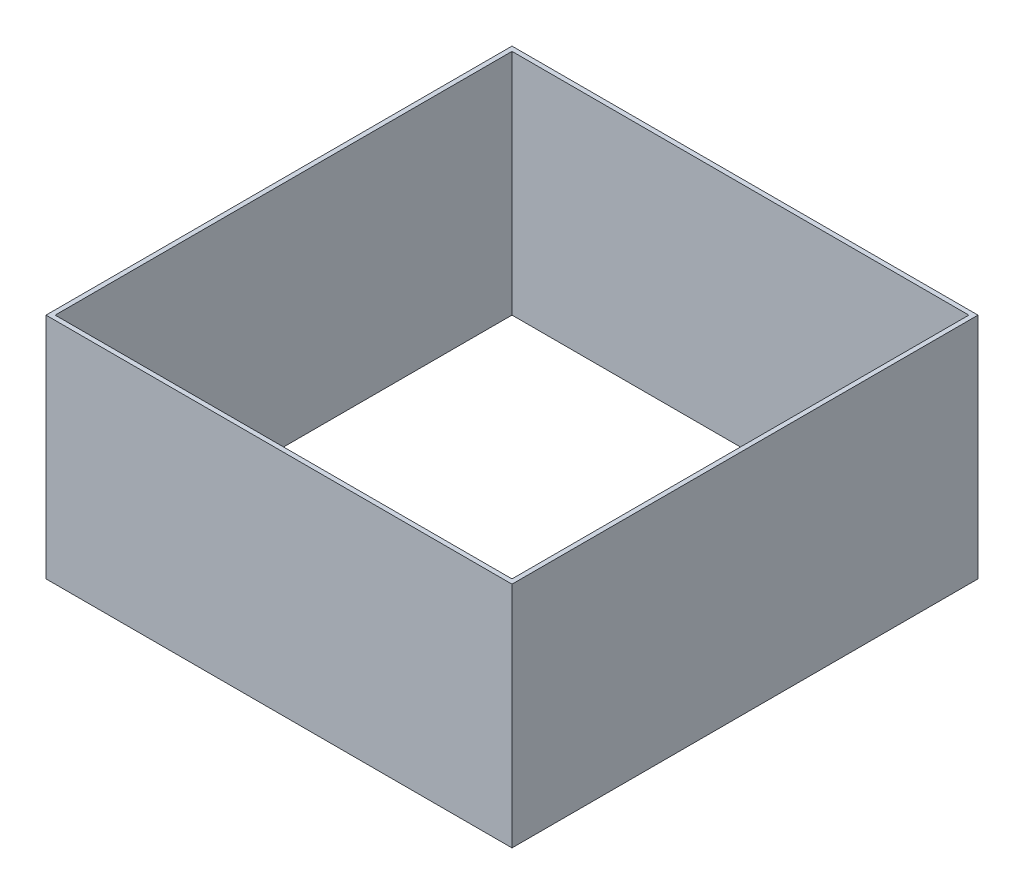
ISO-10303-21;
HEADER;
FILE_DESCRIPTION(('STEP AP214'),'2;1');
FILE_NAME('part.step','',(''),(''),'','','');
FILE_SCHEMA(('AUTOMOTIVE_DESIGN { 1 0 10303 214 1 1 1 1 }'));
ENDSEC;
DATA;
#1=APPLICATION_CONTEXT('core data for automotive mechanical design processes');
#2=APPLICATION_PROTOCOL_DEFINITION('international standard','automotive_design',2000,#1);
#3=PRODUCT_CONTEXT('',#1,'mechanical');
#4=PRODUCT('Part','Part','',(#3));
#5=PRODUCT_RELATED_PRODUCT_CATEGORY('part','',(#4));
#6=PRODUCT_DEFINITION_FORMATION('','',#4);
#7=PRODUCT_DEFINITION_CONTEXT('part definition',#1,'design');
#8=PRODUCT_DEFINITION('design','',#6,#7);
#9=PRODUCT_DEFINITION_SHAPE('','',#8);
#10=(LENGTH_UNIT() NAMED_UNIT(*) SI_UNIT(.MILLI.,.METRE.));
#11=(NAMED_UNIT(*) PLANE_ANGLE_UNIT() SI_UNIT($,.RADIAN.));
#12=(NAMED_UNIT(*) SI_UNIT($,.STERADIAN.) SOLID_ANGLE_UNIT());
#13=UNCERTAINTY_MEASURE_WITH_UNIT(LENGTH_MEASURE(1.E-05),#10,'distance_accuracy_value','');
#14=(GEOMETRIC_REPRESENTATION_CONTEXT(3) GLOBAL_UNCERTAINTY_ASSIGNED_CONTEXT((#13)) GLOBAL_UNIT_ASSIGNED_CONTEXT((#10,
#11,#12)) REPRESENTATION_CONTEXT('',''));
#15=CARTESIAN_POINT('',(0.,0.,0.));
#16=DIRECTION('',(0.,0.,1.));
#17=DIRECTION('',(1.,0.,0.));
#18=AXIS2_PLACEMENT_3D('',#15,#16,#17);
#19=CARTESIAN_POINT('',(0.,100.,0.));
#20=DIRECTION('',(0.,1.,0.));
#21=DIRECTION('',(0.,0.,1.));
#22=AXIS2_PLACEMENT_3D('',#19,#20,#21);
#23=PLANE('',#22);
#24=DIRECTION('',(0.,0.,1.));
#25=VECTOR('',#24,1.);
#26=CARTESIAN_POINT('',(-102.,100.,102.));
#27=LINE('',#26,#25);
#28=CARTESIAN_POINT('',(-102.,100.,-102.));
#29=VERTEX_POINT('',#28);
#30=CARTESIAN_POINT('',(-102.,100.,102.));
#31=VERTEX_POINT('',#30);
#32=EDGE_CURVE('E159',#29,#31,#27,.T.);
#33=ORIENTED_EDGE('',*,*,#32,.T.);
#34=DIRECTION('',(1.,0.,0.));
#35=VECTOR('',#34,1.);
#36=CARTESIAN_POINT('',(102.,100.,102.));
#37=LINE('',#36,#35);
#38=CARTESIAN_POINT('',(102.,100.,102.));
#39=VERTEX_POINT('',#38);
#40=EDGE_CURVE('E163',#31,#39,#37,.T.);
#41=ORIENTED_EDGE('',*,*,#40,.T.);
#42=DIRECTION('',(0.,0.,-1.));
#43=VECTOR('',#42,1.);
#44=CARTESIAN_POINT('',(102.,100.,102.));
#45=LINE('',#44,#43);
#46=CARTESIAN_POINT('',(102.,100.,-102.));
#47=VERTEX_POINT('',#46);
#48=EDGE_CURVE('E167',#39,#47,#45,.T.);
#49=ORIENTED_EDGE('',*,*,#48,.T.);
#50=DIRECTION('',(-1.,0.,0.));
#51=VECTOR('',#50,1.);
#52=CARTESIAN_POINT('',(102.,100.,-102.));
#53=LINE('',#52,#51);
#54=EDGE_CURVE('E170',#47,#29,#53,.T.);
#55=ORIENTED_EDGE('',*,*,#54,.T.);
#56=EDGE_LOOP('',(#33,#41,#49,#55));
#57=FACE_BOUND('',#56,.T.);
#58=DIRECTION('',(1.,0.,0.));
#59=VECTOR('',#58,1.);
#60=CARTESIAN_POINT('',(100.,100.,99.9999999999999));
#61=LINE('',#60,#59);
#62=CARTESIAN_POINT('',(-99.9999999999999,100.,100.));
#63=VERTEX_POINT('',#62);
#64=CARTESIAN_POINT('',(100.,100.,99.9999999999999));
#65=VERTEX_POINT('',#64);
#66=EDGE_CURVE('E120',#63,#65,#61,.T.);
#67=ORIENTED_EDGE('',*,*,#66,.F.);
#68=DIRECTION('',(0.,0.,1.));
#69=VECTOR('',#68,1.);
#70=CARTESIAN_POINT('',(-99.9999999999999,100.,100.));
#71=LINE('',#70,#69);
#72=CARTESIAN_POINT('',(-99.9999999999999,100.,-100.));
#73=VERTEX_POINT('',#72);
#74=EDGE_CURVE('E111',#73,#63,#71,.T.);
#75=ORIENTED_EDGE('',*,*,#74,.F.);
#76=DIRECTION('',(-1.,0.,0.));
#77=VECTOR('',#76,1.);
#78=CARTESIAN_POINT('',(100.,100.,-100.));
#79=LINE('',#78,#77);
#80=CARTESIAN_POINT('',(100.,100.,-100.));
#81=VERTEX_POINT('',#80);
#82=EDGE_CURVE('E137',#81,#73,#79,.T.);
#83=ORIENTED_EDGE('',*,*,#82,.F.);
#84=DIRECTION('',(0.,0.,-1.));
#85=VECTOR('',#84,1.);
#86=CARTESIAN_POINT('',(100.,100.,99.9999999999999));
#87=LINE('',#86,#85);
#88=EDGE_CURVE('E133',#65,#81,#87,.T.);
#89=ORIENTED_EDGE('',*,*,#88,.F.);
#90=EDGE_LOOP('',(#67,#75,#83,#89));
#91=FACE_BOUND('',#90,.T.);
#92=ADVANCED_FACE('F45',(#57,#91),#23,.T.);
#93=CARTESIAN_POINT('',(0.,0.,0.));
#94=DIRECTION('',(0.,1.,0.));
#95=DIRECTION('',(0.,0.,1.));
#96=AXIS2_PLACEMENT_3D('',#93,#94,#95);
#97=PLANE('',#96);
#98=DIRECTION('',(0.,0.,1.));
#99=VECTOR('',#98,1.);
#100=CARTESIAN_POINT('',(-102.,0.,102.));
#101=LINE('',#100,#99);
#102=CARTESIAN_POINT('',(-102.,0.,-102.));
#103=VERTEX_POINT('',#102);
#104=CARTESIAN_POINT('',(-102.,0.,102.));
#105=VERTEX_POINT('',#104);
#106=EDGE_CURVE('E129',#103,#105,#101,.T.);
#107=ORIENTED_EDGE('',*,*,#106,.F.);
#108=DIRECTION('',(-1.,0.,0.));
#109=VECTOR('',#108,1.);
#110=CARTESIAN_POINT('',(102.,0.,-102.));
#111=LINE('',#110,#109);
#112=CARTESIAN_POINT('',(102.,0.,-102.));
#113=VERTEX_POINT('',#112);
#114=EDGE_CURVE('E164',#113,#103,#111,.T.);
#115=ORIENTED_EDGE('',*,*,#114,.F.);
#116=DIRECTION('',(0.,0.,-1.));
#117=VECTOR('',#116,1.);
#118=CARTESIAN_POINT('',(102.,0.,102.));
#119=LINE('',#118,#117);
#120=CARTESIAN_POINT('',(102.,0.,102.));
#121=VERTEX_POINT('',#120);
#122=EDGE_CURVE('E180',#121,#113,#119,.T.);
#123=ORIENTED_EDGE('',*,*,#122,.F.);
#124=DIRECTION('',(1.,0.,0.));
#125=VECTOR('',#124,1.);
#126=CARTESIAN_POINT('',(102.,0.,102.));
#127=LINE('',#126,#125);
#128=EDGE_CURVE('E177',#105,#121,#127,.T.);
#129=ORIENTED_EDGE('',*,*,#128,.F.);
#130=EDGE_LOOP('',(#107,#115,#123,#129));
#131=FACE_BOUND('',#130,.T.);
#132=DIRECTION('',(0.,0.,1.));
#133=VECTOR('',#132,1.);
#134=CARTESIAN_POINT('',(-99.9999999999999,0.,100.));
#135=LINE('',#134,#133);
#136=CARTESIAN_POINT('',(-99.9999999999999,0.,-100.));
#137=VERTEX_POINT('',#136);
#138=CARTESIAN_POINT('',(-99.9999999999999,0.,100.));
#139=VERTEX_POINT('',#138);
#140=EDGE_CURVE('E69',#137,#139,#135,.T.);
#141=ORIENTED_EDGE('',*,*,#140,.T.);
#142=DIRECTION('',(1.,0.,0.));
#143=VECTOR('',#142,1.);
#144=CARTESIAN_POINT('',(100.,0.,99.9999999999999));
#145=LINE('',#144,#143);
#146=CARTESIAN_POINT('',(100.,0.,99.9999999999999));
#147=VERTEX_POINT('',#146);
#148=EDGE_CURVE('E127',#139,#147,#145,.T.);
#149=ORIENTED_EDGE('',*,*,#148,.T.);
#150=DIRECTION('',(0.,0.,-1.));
#151=VECTOR('',#150,1.);
#152=CARTESIAN_POINT('',(100.,0.,99.9999999999999));
#153=LINE('',#152,#151);
#154=CARTESIAN_POINT('',(100.,0.,-100.));
#155=VERTEX_POINT('',#154);
#156=EDGE_CURVE('E146',#147,#155,#153,.T.);
#157=ORIENTED_EDGE('',*,*,#156,.T.);
#158=DIRECTION('',(-1.,0.,0.));
#159=VECTOR('',#158,1.);
#160=CARTESIAN_POINT('',(100.,0.,-100.));
#161=LINE('',#160,#159);
#162=EDGE_CURVE('E121',#155,#137,#161,.T.);
#163=ORIENTED_EDGE('',*,*,#162,.T.);
#164=EDGE_LOOP('',(#141,#149,#157,#163));
#165=FACE_BOUND('',#164,.T.);
#166=ADVANCED_FACE('F203',(#131,#165),#97,.F.);
#167=CARTESIAN_POINT('',(-102.,100.,102.));
#168=DIRECTION('',(1.,0.,0.));
#169=DIRECTION('',(0.,0.,-1.));
#170=AXIS2_PLACEMENT_3D('',#167,#168,#169);
#171=PLANE('',#170);
#172=ORIENTED_EDGE('',*,*,#106,.T.);
#173=DIRECTION('',(0.,-1.,0.));
#174=VECTOR('',#173,1.);
#175=CARTESIAN_POINT('',(-102.,100.,102.));
#176=LINE('',#175,#174);
#177=EDGE_CURVE('E11',#31,#105,#176,.T.);
#178=ORIENTED_EDGE('',*,*,#177,.F.);
#179=ORIENTED_EDGE('',*,*,#32,.F.);
#180=DIRECTION('',(0.,-1.,0.));
#181=VECTOR('',#180,1.);
#182=CARTESIAN_POINT('',(-102.,100.,-102.));
#183=LINE('',#182,#181);
#184=EDGE_CURVE('E173',#29,#103,#183,.T.);
#185=ORIENTED_EDGE('',*,*,#184,.T.);
#186=EDGE_LOOP('',(#172,#178,#179,#185));
#187=FACE_BOUND('',#186,.T.);
#188=ADVANCED_FACE('F47',(#187),#171,.F.);
#189=CARTESIAN_POINT('',(102.,100.,102.));
#190=DIRECTION('',(0.,0.,-1.));
#191=DIRECTION('',(-1.,0.,0.));
#192=AXIS2_PLACEMENT_3D('',#189,#190,#191);
#193=PLANE('',#192);
#194=ORIENTED_EDGE('',*,*,#128,.T.);
#195=DIRECTION('',(0.,-1.,0.));
#196=VECTOR('',#195,1.);
#197=CARTESIAN_POINT('',(102.,100.,102.));
#198=LINE('',#197,#196);
#199=EDGE_CURVE('E54',#39,#121,#198,.T.);
#200=ORIENTED_EDGE('',*,*,#199,.F.);
#201=ORIENTED_EDGE('',*,*,#40,.F.);
#202=ORIENTED_EDGE('',*,*,#177,.T.);
#203=EDGE_LOOP('',(#194,#200,#201,#202));
#204=FACE_BOUND('',#203,.T.);
#205=ADVANCED_FACE('F213',(#204),#193,.F.);
#206=CARTESIAN_POINT('',(102.,100.,102.));
#207=DIRECTION('',(-1.,0.,0.));
#208=DIRECTION('',(0.,0.,1.));
#209=AXIS2_PLACEMENT_3D('',#206,#207,#208);
#210=PLANE('',#209);
#211=ORIENTED_EDGE('',*,*,#122,.T.);
#212=DIRECTION('',(0.,-1.,0.));
#213=VECTOR('',#212,1.);
#214=CARTESIAN_POINT('',(102.,100.,-102.));
#215=LINE('',#214,#213);
#216=EDGE_CURVE('E188',#47,#113,#215,.T.);
#217=ORIENTED_EDGE('',*,*,#216,.F.);
#218=ORIENTED_EDGE('',*,*,#48,.F.);
#219=ORIENTED_EDGE('',*,*,#199,.T.);
#220=EDGE_LOOP('',(#211,#217,#218,#219));
#221=FACE_BOUND('',#220,.T.);
#222=ADVANCED_FACE('F197',(#221),#210,.F.);
#223=CARTESIAN_POINT('',(102.,100.,-102.));
#224=DIRECTION('',(0.,0.,1.));
#225=DIRECTION('',(1.,0.,0.));
#226=AXIS2_PLACEMENT_3D('',#223,#224,#225);
#227=PLANE('',#226);
#228=ORIENTED_EDGE('',*,*,#114,.T.);
#229=ORIENTED_EDGE('',*,*,#184,.F.);
#230=ORIENTED_EDGE('',*,*,#54,.F.);
#231=ORIENTED_EDGE('',*,*,#216,.T.);
#232=EDGE_LOOP('',(#228,#229,#230,#231));
#233=FACE_BOUND('',#232,.T.);
#234=ADVANCED_FACE('F207',(#233),#227,.F.);
#235=CARTESIAN_POINT('',(-99.9999999999999,100.,100.));
#236=DIRECTION('',(1.,0.,0.));
#237=DIRECTION('',(0.,0.,-1.));
#238=AXIS2_PLACEMENT_3D('',#235,#236,#237);
#239=PLANE('',#238);
#240=ORIENTED_EDGE('',*,*,#140,.F.);
#241=DIRECTION('',(0.,-1.,0.));
#242=VECTOR('',#241,1.);
#243=CARTESIAN_POINT('',(-99.9999999999999,100.,-100.));
#244=LINE('',#243,#242);
#245=EDGE_CURVE('E115',#73,#137,#244,.T.);
#246=ORIENTED_EDGE('',*,*,#245,.F.);
#247=ORIENTED_EDGE('',*,*,#74,.T.);
#248=DIRECTION('',(0.,-1.,0.));
#249=VECTOR('',#248,1.);
#250=CARTESIAN_POINT('',(-99.9999999999999,100.,100.));
#251=LINE('',#250,#249);
#252=EDGE_CURVE('E114',#63,#139,#251,.T.);
#253=ORIENTED_EDGE('',*,*,#252,.T.);
#254=EDGE_LOOP('',(#240,#246,#247,#253));
#255=FACE_BOUND('',#254,.T.);
#256=ADVANCED_FACE('F113',(#255),#239,.T.);
#257=CARTESIAN_POINT('',(100.,100.,99.9999999999999));
#258=DIRECTION('',(0.,0.,-1.));
#259=DIRECTION('',(-1.,0.,0.));
#260=AXIS2_PLACEMENT_3D('',#257,#258,#259);
#261=PLANE('',#260);
#262=ORIENTED_EDGE('',*,*,#148,.F.);
#263=ORIENTED_EDGE('',*,*,#252,.F.);
#264=ORIENTED_EDGE('',*,*,#66,.T.);
#265=DIRECTION('',(0.,-1.,0.));
#266=VECTOR('',#265,1.);
#267=CARTESIAN_POINT('',(100.,100.,99.9999999999999));
#268=LINE('',#267,#266);
#269=EDGE_CURVE('E130',#65,#147,#268,.T.);
#270=ORIENTED_EDGE('',*,*,#269,.T.);
#271=EDGE_LOOP('',(#262,#263,#264,#270));
#272=FACE_BOUND('',#271,.T.);
#273=ADVANCED_FACE('F124',(#272),#261,.T.);
#274=CARTESIAN_POINT('',(100.,100.,99.9999999999999));
#275=DIRECTION('',(-1.,0.,0.));
#276=DIRECTION('',(0.,0.,1.));
#277=AXIS2_PLACEMENT_3D('',#274,#275,#276);
#278=PLANE('',#277);
#279=ORIENTED_EDGE('',*,*,#156,.F.);
#280=ORIENTED_EDGE('',*,*,#269,.F.);
#281=ORIENTED_EDGE('',*,*,#88,.T.);
#282=DIRECTION('',(0.,-1.,0.));
#283=VECTOR('',#282,1.);
#284=CARTESIAN_POINT('',(100.,100.,-100.));
#285=LINE('',#284,#283);
#286=EDGE_CURVE('E61',#81,#155,#285,.T.);
#287=ORIENTED_EDGE('',*,*,#286,.T.);
#288=EDGE_LOOP('',(#279,#280,#281,#287));
#289=FACE_BOUND('',#288,.T.);
#290=ADVANCED_FACE('F236',(#289),#278,.T.);
#291=CARTESIAN_POINT('',(100.,100.,-100.));
#292=DIRECTION('',(0.,0.,1.));
#293=DIRECTION('',(1.,0.,0.));
#294=AXIS2_PLACEMENT_3D('',#291,#292,#293);
#295=PLANE('',#294);
#296=ORIENTED_EDGE('',*,*,#162,.F.);
#297=ORIENTED_EDGE('',*,*,#286,.F.);
#298=ORIENTED_EDGE('',*,*,#82,.T.);
#299=ORIENTED_EDGE('',*,*,#245,.T.);
#300=EDGE_LOOP('',(#296,#297,#298,#299));
#301=FACE_BOUND('',#300,.T.);
#302=ADVANCED_FACE('F240',(#301),#295,.T.);
#303=CLOSED_SHELL('',(#92,#166,#188,#205,#222,#234,#256,#273,#290,#302));
#304=MANIFOLD_SOLID_BREP('B2',#303);
#305=ADVANCED_BREP_SHAPE_REPRESENTATION('',(#18,#304),#14);
#306=SHAPE_DEFINITION_REPRESENTATION(#9,#305);
ENDSEC;
END-ISO-10303-21;
